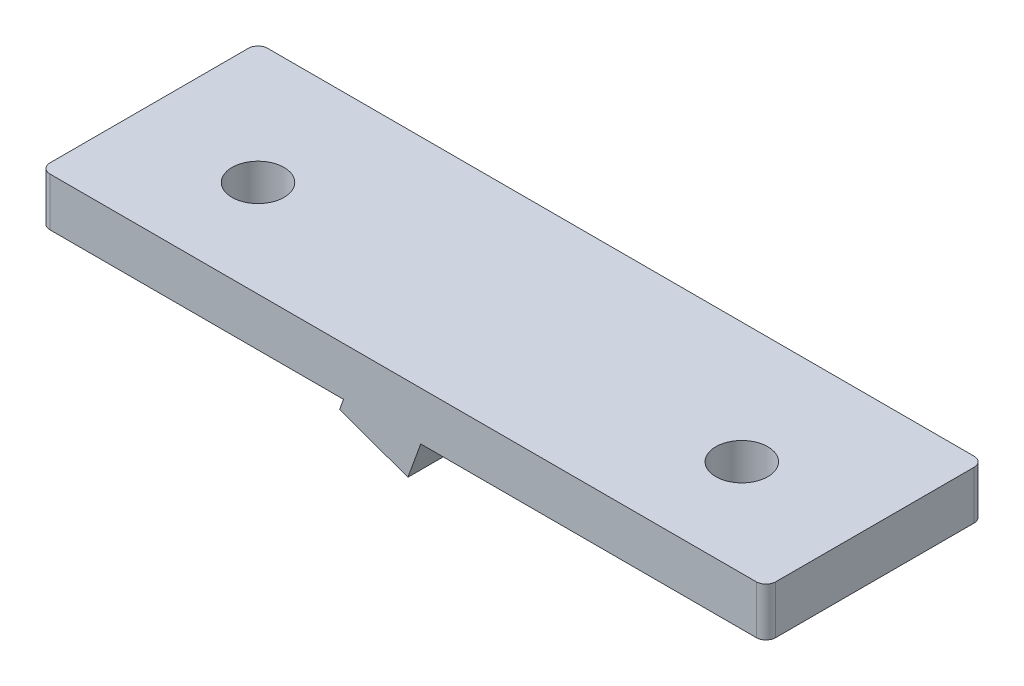
ISO-10303-21;
HEADER;
FILE_DESCRIPTION(('STEP AP214'),'2;1');
FILE_NAME('part.step','',(''),(''),'','','');
FILE_SCHEMA(('AUTOMOTIVE_DESIGN { 1 0 10303 214 1 1 1 1 }'));
ENDSEC;
DATA;
#1=APPLICATION_CONTEXT('core data for automotive mechanical design processes');
#2=APPLICATION_PROTOCOL_DEFINITION('international standard','automotive_design',2000,#1);
#3=PRODUCT_CONTEXT('',#1,'mechanical');
#4=PRODUCT('Part','Part','',(#3));
#5=PRODUCT_RELATED_PRODUCT_CATEGORY('part','',(#4));
#6=PRODUCT_DEFINITION_FORMATION('','',#4);
#7=PRODUCT_DEFINITION_CONTEXT('part definition',#1,'design');
#8=PRODUCT_DEFINITION('design','',#6,#7);
#9=PRODUCT_DEFINITION_SHAPE('','',#8);
#10=(LENGTH_UNIT() NAMED_UNIT(*) SI_UNIT(.MILLI.,.METRE.));
#11=(NAMED_UNIT(*) PLANE_ANGLE_UNIT() SI_UNIT($,.RADIAN.));
#12=(NAMED_UNIT(*) SI_UNIT($,.STERADIAN.) SOLID_ANGLE_UNIT());
#13=UNCERTAINTY_MEASURE_WITH_UNIT(LENGTH_MEASURE(1.E-05),#10,'distance_accuracy_value','');
#14=(GEOMETRIC_REPRESENTATION_CONTEXT(3) GLOBAL_UNCERTAINTY_ASSIGNED_CONTEXT((#13)) GLOBAL_UNIT_ASSIGNED_CONTEXT((#10,
#11,#12)) REPRESENTATION_CONTEXT('',''));
#15=CARTESIAN_POINT('',(0.,0.,0.));
#16=DIRECTION('',(0.,0.,1.));
#17=DIRECTION('',(1.,0.,0.));
#18=AXIS2_PLACEMENT_3D('',#15,#16,#17);
#19=CARTESIAN_POINT('',(0.,0.,0.));
#20=DIRECTION('',(0.,1.,0.));
#21=DIRECTION('',(0.,0.,1.));
#22=AXIS2_PLACEMENT_3D('',#19,#20,#21);
#23=PLANE('',#22);
#24=CARTESIAN_POINT('',(20.,0.,-8.));
#25=DIRECTION('',(0.,1.,0.));
#26=DIRECTION('',(0.,0.,1.));
#27=AXIS2_PLACEMENT_3D('',#24,#25,#26);
#28=CIRCLE('',#27,2.15);
#29=CARTESIAN_POINT('',(20.,0.,-5.85));
#30=VERTEX_POINT('',#29);
#31=EDGE_CURVE('E264',#30,#30,#28,.T.);
#32=ORIENTED_EDGE('',*,*,#31,.T.);
#33=EDGE_LOOP('',(#32));
#34=FACE_BOUND('',#33,.T.);
#35=DIRECTION('',(0.,0.,-1.));
#36=VECTOR('',#35,1.);
#37=CARTESIAN_POINT('',(30.,0.,-18.));
#38=LINE('',#37,#36);
#39=CARTESIAN_POINT('',(30.,0.,-0.799999999999999));
#40=VERTEX_POINT('',#39);
#41=CARTESIAN_POINT('',(30.,0.,-17.2));
#42=VERTEX_POINT('',#41);
#43=EDGE_CURVE('E291',#40,#42,#38,.T.);
#44=ORIENTED_EDGE('',*,*,#43,.F.);
#45=CARTESIAN_POINT('',(29.2,0.,-0.799999999999999));
#46=DIRECTION('',(0.,1.,0.));
#47=DIRECTION('',(0.,0.,1.));
#48=AXIS2_PLACEMENT_3D('',#45,#46,#47);
#49=CIRCLE('',#48,0.8);
#50=CARTESIAN_POINT('',(29.2,0.,0.));
#51=VERTEX_POINT('',#50);
#52=EDGE_CURVE('E11',#40,#51,#49,.F.);
#53=ORIENTED_EDGE('',*,*,#52,.T.);
#54=DIRECTION('',(1.,0.,0.));
#55=VECTOR('',#54,1.);
#56=CARTESIAN_POINT('',(-30.,0.,0.));
#57=LINE('',#56,#55);
#58=CARTESIAN_POINT('',(1.45415986702924,0.,0.));
#59=VERTEX_POINT('',#58);
#60=EDGE_CURVE('E289',#59,#51,#57,.T.);
#61=ORIENTED_EDGE('',*,*,#60,.F.);
#62=DIRECTION('',(0.,0.,-1.));
#63=VECTOR('',#62,1.);
#64=CARTESIAN_POINT('',(1.45415986702924,0.,0.));
#65=LINE('',#64,#63);
#66=CARTESIAN_POINT('',(1.45415986702924,0.,-4.00000000000002));
#67=VERTEX_POINT('',#66);
#68=EDGE_CURVE('E224',#59,#67,#65,.T.);
#69=ORIENTED_EDGE('',*,*,#68,.T.);
#70=CARTESIAN_POINT('',(-1.73837345039849,0.,-8.00000000000002));
#71=DIRECTION('',(0.,1.,0.));
#72=DIRECTION('',(1.,0.,0.));
#73=AXIS2_PLACEMENT_3D('',#70,#71,#72);
#74=ELLIPSE('',#73,5.32088886237956,5.);
#75=CARTESIAN_POINT('',(1.45415986702924,0.,-12.));
#76=VERTEX_POINT('',#75);
#77=EDGE_CURVE('E302',#67,#76,#74,.T.);
#78=ORIENTED_EDGE('',*,*,#77,.T.);
#79=DIRECTION('',(0.,0.,-1.));
#80=VECTOR('',#79,1.);
#81=CARTESIAN_POINT('',(1.45415986702924,0.,0.));
#82=LINE('',#81,#80);
#83=CARTESIAN_POINT('',(1.45415986702926,0.,-15.8));
#84=VERTEX_POINT('',#83);
#85=EDGE_CURVE('E211',#76,#84,#82,.T.);
#86=ORIENTED_EDGE('',*,*,#85,.T.);
#87=DIRECTION('',(1.,0.,0.));
#88=VECTOR('',#87,1.);
#89=CARTESIAN_POINT('',(19.3323464446246,0.,-15.8));
#90=LINE('',#89,#88);
#91=CARTESIAN_POINT('',(19.3323464446246,0.,-15.8));
#92=VERTEX_POINT('',#91);
#93=EDGE_CURVE('E251',#84,#92,#90,.T.);
#94=ORIENTED_EDGE('',*,*,#93,.T.);
#95=DIRECTION('',(0.,0.,-1.));
#96=VECTOR('',#95,1.);
#97=CARTESIAN_POINT('',(19.3323464446246,0.,-15.8));
#98=LINE('',#97,#96);
#99=CARTESIAN_POINT('',(19.3323464446246,0.,-18.));
#100=VERTEX_POINT('',#99);
#101=EDGE_CURVE('E255',#92,#100,#98,.T.);
#102=ORIENTED_EDGE('',*,*,#101,.T.);
#103=DIRECTION('',(-1.,0.,0.));
#104=VECTOR('',#103,1.);
#105=CARTESIAN_POINT('',(-30.,0.,-18.));
#106=LINE('',#105,#104);
#107=CARTESIAN_POINT('',(29.2,0.,-18.));
#108=VERTEX_POINT('',#107);
#109=EDGE_CURVE('E277',#108,#100,#106,.T.);
#110=ORIENTED_EDGE('',*,*,#109,.F.);
#111=CARTESIAN_POINT('',(29.2,0.,-17.2));
#112=DIRECTION('',(0.,1.,0.));
#113=DIRECTION('',(0.,0.,1.));
#114=AXIS2_PLACEMENT_3D('',#111,#112,#113);
#115=CIRCLE('',#114,0.8);
#116=EDGE_CURVE('E45',#108,#42,#115,.F.);
#117=ORIENTED_EDGE('',*,*,#116,.T.);
#118=EDGE_LOOP('',(#44,#53,#61,#69,#78,#86,#94,#102,#110,#117));
#119=FACE_BOUND('',#118,.T.);
#120=ADVANCED_FACE('F37',(#34,#119),#23,.F.);
#121=CARTESIAN_POINT('',(0.,0.,-15.8));
#122=DIRECTION('',(0.,0.,-1.));
#123=DIRECTION('',(-1.,0.,0.));
#124=AXIS2_PLACEMENT_3D('',#121,#122,#123);
#125=PLANE('',#124);
#126=DIRECTION('',(0.939692620785908,-0.342020143325671,0.));
#127=VECTOR('',#126,1.);
#128=CARTESIAN_POINT('',(-0.893674788207497,-2.45535130093597,-15.8));
#129=LINE('',#128,#127);
#130=CARTESIAN_POINT('',(-7.63969704435782,0.,-15.8));
#131=VERTEX_POINT('',#130);
#132=CARTESIAN_POINT('',(-5.24777503663613,-0.870588413496862,-15.8));
#133=VERTEX_POINT('',#132);
#134=EDGE_CURVE('E295',#131,#133,#129,.T.);
#135=ORIENTED_EDGE('',*,*,#134,.T.);
#136=DIRECTION('',(0.342020143325669,0.939692620785908,0.));
#137=VECTOR('',#136,1.);
#138=CARTESIAN_POINT('',(-4.35410024842863,1.5847628874391,-15.8));
#139=LINE('',#138,#137);
#140=CARTESIAN_POINT('',(-4.9309067678262,0.,-15.8));
#141=VERTEX_POINT('',#140);
#142=EDGE_CURVE('E218',#133,#141,#139,.T.);
#143=ORIENTED_EDGE('',*,*,#142,.T.);
#144=EDGE_CURVE('E252',#131,#141,#90,.T.);
#145=ORIENTED_EDGE('',*,*,#144,.F.);
#146=EDGE_LOOP('',(#135,#143,#145));
#147=FACE_BOUND('',#146,.T.);
#148=ADVANCED_FACE('F379',(#147),#125,.F.);
#149=CARTESIAN_POINT('',(-20.,0.,-8.));
#150=DIRECTION('',(0.,1.,0.));
#151=DIRECTION('',(0.,0.,1.));
#152=AXIS2_PLACEMENT_3D('',#149,#150,#151);
#153=CIRCLE('',#152,2.15);
#154=CARTESIAN_POINT('',(-20.,0.,-5.85));
#155=VERTEX_POINT('',#154);
#156=EDGE_CURVE('E260',#155,#155,#153,.T.);
#157=ORIENTED_EDGE('',*,*,#156,.T.);
#158=EDGE_LOOP('',(#157));
#159=FACE_BOUND('',#158,.T.);
#160=DIRECTION('',(0.,0.,1.));
#161=VECTOR('',#160,1.);
#162=CARTESIAN_POINT('',(-30.,0.,-18.));
#163=LINE('',#162,#161);
#164=CARTESIAN_POINT('',(-30.,0.,-17.2));
#165=VERTEX_POINT('',#164);
#166=CARTESIAN_POINT('',(-30.,0.,-0.799999999999999));
#167=VERTEX_POINT('',#166);
#168=EDGE_CURVE('E270',#165,#167,#163,.T.);
#169=ORIENTED_EDGE('',*,*,#168,.F.);
#170=CARTESIAN_POINT('',(-29.2,0.,-17.2));
#171=DIRECTION('',(0.,1.,0.));
#172=DIRECTION('',(0.,0.,1.));
#173=AXIS2_PLACEMENT_3D('',#170,#171,#172);
#174=CIRCLE('',#173,0.8);
#175=CARTESIAN_POINT('',(-29.2,0.,-18.));
#176=VERTEX_POINT('',#175);
#177=EDGE_CURVE('E311',#165,#176,#174,.F.);
#178=ORIENTED_EDGE('',*,*,#177,.T.);
#179=CARTESIAN_POINT('',(-10.2517956302058,0.,-18.));
#180=VERTEX_POINT('',#179);
#181=EDGE_CURVE('E293',#180,#176,#106,.T.);
#182=ORIENTED_EDGE('',*,*,#181,.F.);
#183=DIRECTION('',(0.,0.,1.));
#184=VECTOR('',#183,1.);
#185=CARTESIAN_POINT('',(-10.2517956302058,0.,0.));
#186=LINE('',#185,#184);
#187=CARTESIAN_POINT('',(-10.2517956302058,0.,-15.5));
#188=VERTEX_POINT('',#187);
#189=EDGE_CURVE('E244',#180,#188,#186,.T.);
#190=ORIENTED_EDGE('',*,*,#189,.T.);
#191=DIRECTION('',(1.,0.,0.));
#192=VECTOR('',#191,1.);
#193=CARTESIAN_POINT('',(0.,0.,-15.5));
#194=LINE('',#193,#192);
#195=CARTESIAN_POINT('',(-7.63969704435756,0.,-15.5));
#196=VERTEX_POINT('',#195);
#197=EDGE_CURVE('E297',#188,#196,#194,.T.);
#198=ORIENTED_EDGE('',*,*,#197,.T.);
#199=DIRECTION('',(0.,0.,-1.));
#200=VECTOR('',#199,1.);
#201=CARTESIAN_POINT('',(-7.63969704435756,0.,0.));
#202=LINE('',#201,#200);
#203=EDGE_CURVE('E241',#196,#131,#202,.T.);
#204=ORIENTED_EDGE('',*,*,#203,.T.);
#205=ORIENTED_EDGE('',*,*,#144,.T.);
#206=DIRECTION('',(0.,0.,1.));
#207=VECTOR('',#206,1.);
#208=CARTESIAN_POINT('',(-4.93090676782623,0.,0.));
#209=LINE('',#208,#207);
#210=CARTESIAN_POINT('',(-4.93090676782623,0.,-12.));
#211=VERTEX_POINT('',#210);
#212=EDGE_CURVE('E220',#141,#211,#209,.T.);
#213=ORIENTED_EDGE('',*,*,#212,.T.);
#214=CARTESIAN_POINT('',(-1.73837345039849,0.,-8.00000000000002));
#215=DIRECTION('',(0.,1.,0.));
#216=DIRECTION('',(1.,0.,0.));
#217=AXIS2_PLACEMENT_3D('',#214,#215,#216);
#218=ELLIPSE('',#217,5.32088886237956,5.);
#219=CARTESIAN_POINT('',(-4.93090676782623,0.,-4.00000000000002));
#220=VERTEX_POINT('',#219);
#221=EDGE_CURVE('E300',#211,#220,#218,.T.);
#222=ORIENTED_EDGE('',*,*,#221,.T.);
#223=DIRECTION('',(0.,0.,1.));
#224=VECTOR('',#223,1.);
#225=CARTESIAN_POINT('',(-4.93090676782623,0.,0.));
#226=LINE('',#225,#224);
#227=CARTESIAN_POINT('',(-4.93090676782623,0.,0.));
#228=VERTEX_POINT('',#227);
#229=EDGE_CURVE('E222',#220,#228,#226,.T.);
#230=ORIENTED_EDGE('',*,*,#229,.T.);
#231=CARTESIAN_POINT('',(-29.2,0.,0.));
#232=VERTEX_POINT('',#231);
#233=EDGE_CURVE('E197',#232,#228,#57,.T.);
#234=ORIENTED_EDGE('',*,*,#233,.F.);
#235=CARTESIAN_POINT('',(-29.2,0.,-0.8));
#236=DIRECTION('',(0.,1.,0.));
#237=DIRECTION('',(0.,0.,1.));
#238=AXIS2_PLACEMENT_3D('',#235,#236,#237);
#239=CIRCLE('',#238,0.8);
#240=EDGE_CURVE('E309',#232,#167,#239,.F.);
#241=ORIENTED_EDGE('',*,*,#240,.T.);
#242=EDGE_LOOP('',(#169,#178,#182,#190,#198,#204,#205,#213,#222,#230,#234,#241));
#243=FACE_BOUND('',#242,.T.);
#244=ADVANCED_FACE('F352',(#159,#243),#23,.F.);
#245=CARTESIAN_POINT('',(0.,4.,0.));
#246=DIRECTION('',(0.,1.,0.));
#247=DIRECTION('',(0.,0.,1.));
#248=AXIS2_PLACEMENT_3D('',#245,#246,#247);
#249=PLANE('',#248);
#250=CARTESIAN_POINT('',(20.,4.,-8.));
#251=DIRECTION('',(0.,1.,0.));
#252=DIRECTION('',(0.,0.,1.));
#253=AXIS2_PLACEMENT_3D('',#250,#251,#252);
#254=CIRCLE('',#253,2.15);
#255=CARTESIAN_POINT('',(20.,4.,-5.85));
#256=VERTEX_POINT('',#255);
#257=EDGE_CURVE('E267',#256,#256,#254,.T.);
#258=ORIENTED_EDGE('',*,*,#257,.F.);
#259=EDGE_LOOP('',(#258));
#260=FACE_BOUND('',#259,.T.);
#261=DIRECTION('',(-1.,0.,0.));
#262=VECTOR('',#261,1.);
#263=CARTESIAN_POINT('',(-30.,4.,-18.));
#264=LINE('',#263,#262);
#265=CARTESIAN_POINT('',(29.2,4.,-18.));
#266=VERTEX_POINT('',#265);
#267=CARTESIAN_POINT('',(-29.2,4.,-18.));
#268=VERTEX_POINT('',#267);
#269=EDGE_CURVE('E283',#266,#268,#264,.T.);
#270=ORIENTED_EDGE('',*,*,#269,.T.);
#271=CARTESIAN_POINT('',(-29.2,4.,-17.2));
#272=DIRECTION('',(0.,1.,0.));
#273=DIRECTION('',(0.,0.,1.));
#274=AXIS2_PLACEMENT_3D('',#271,#272,#273);
#275=CIRCLE('',#274,0.8);
#276=CARTESIAN_POINT('',(-30.,4.,-17.2));
#277=VERTEX_POINT('',#276);
#278=EDGE_CURVE('E324',#268,#277,#275,.T.);
#279=ORIENTED_EDGE('',*,*,#278,.T.);
#280=DIRECTION('',(0.,0.,1.));
#281=VECTOR('',#280,1.);
#282=CARTESIAN_POINT('',(-30.,4.,-18.));
#283=LINE('',#282,#281);
#284=CARTESIAN_POINT('',(-30.,4.,-0.799999999999999));
#285=VERTEX_POINT('',#284);
#286=EDGE_CURVE('E273',#277,#285,#283,.T.);
#287=ORIENTED_EDGE('',*,*,#286,.T.);
#288=CARTESIAN_POINT('',(-29.2,4.,-0.8));
#289=DIRECTION('',(0.,1.,0.));
#290=DIRECTION('',(0.,0.,1.));
#291=AXIS2_PLACEMENT_3D('',#288,#289,#290);
#292=CIRCLE('',#291,0.8);
#293=CARTESIAN_POINT('',(-29.2,4.,0.));
#294=VERTEX_POINT('',#293);
#295=EDGE_CURVE('E322',#285,#294,#292,.T.);
#296=ORIENTED_EDGE('',*,*,#295,.T.);
#297=DIRECTION('',(1.,0.,0.));
#298=VECTOR('',#297,1.);
#299=CARTESIAN_POINT('',(-30.,4.,0.));
#300=LINE('',#299,#298);
#301=CARTESIAN_POINT('',(29.2,4.,0.));
#302=VERTEX_POINT('',#301);
#303=EDGE_CURVE('E276',#294,#302,#300,.T.);
#304=ORIENTED_EDGE('',*,*,#303,.T.);
#305=CARTESIAN_POINT('',(29.2,4.,-0.799999999999999));
#306=DIRECTION('',(0.,1.,0.));
#307=DIRECTION('',(0.,0.,1.));
#308=AXIS2_PLACEMENT_3D('',#305,#306,#307);
#309=CIRCLE('',#308,0.8);
#310=CARTESIAN_POINT('',(30.,4.,-0.799999999999999));
#311=VERTEX_POINT('',#310);
#312=EDGE_CURVE('E320',#302,#311,#309,.T.);
#313=ORIENTED_EDGE('',*,*,#312,.T.);
#314=DIRECTION('',(0.,0.,-1.));
#315=VECTOR('',#314,1.);
#316=CARTESIAN_POINT('',(30.,4.,-18.));
#317=LINE('',#316,#315);
#318=CARTESIAN_POINT('',(30.,4.,-17.2));
#319=VERTEX_POINT('',#318);
#320=EDGE_CURVE('E280',#311,#319,#317,.T.);
#321=ORIENTED_EDGE('',*,*,#320,.T.);
#322=CARTESIAN_POINT('',(29.2,4.,-17.2));
#323=DIRECTION('',(0.,1.,0.));
#324=DIRECTION('',(0.,0.,1.));
#325=AXIS2_PLACEMENT_3D('',#322,#323,#324);
#326=CIRCLE('',#325,0.8);
#327=EDGE_CURVE('E318',#319,#266,#326,.T.);
#328=ORIENTED_EDGE('',*,*,#327,.T.);
#329=EDGE_LOOP('',(#270,#279,#287,#296,#304,#313,#321,#328));
#330=FACE_BOUND('',#329,.T.);
#331=CARTESIAN_POINT('',(-20.,4.,-8.));
#332=DIRECTION('',(0.,1.,0.));
#333=DIRECTION('',(0.,0.,1.));
#334=AXIS2_PLACEMENT_3D('',#331,#332,#333);
#335=CIRCLE('',#334,2.15);
#336=CARTESIAN_POINT('',(-20.,4.,-5.85));
#337=VERTEX_POINT('',#336);
#338=EDGE_CURVE('E261',#337,#337,#335,.T.);
#339=ORIENTED_EDGE('',*,*,#338,.F.);
#340=EDGE_LOOP('',(#339));
#341=FACE_BOUND('',#340,.T.);
#342=ADVANCED_FACE('F342',(#260,#330,#341),#249,.T.);
#343=CARTESIAN_POINT('',(-30.,4.,-18.));
#344=DIRECTION('',(1.,0.,0.));
#345=DIRECTION('',(0.,0.,-1.));
#346=AXIS2_PLACEMENT_3D('',#343,#344,#345);
#347=PLANE('',#346);
#348=ORIENTED_EDGE('',*,*,#286,.F.);
#349=DIRECTION('',(0.,-1.,0.));
#350=VECTOR('',#349,1.);
#351=CARTESIAN_POINT('',(-30.,4.,-17.2));
#352=LINE('',#351,#350);
#353=EDGE_CURVE('E306',#277,#165,#352,.T.);
#354=ORIENTED_EDGE('',*,*,#353,.T.);
#355=ORIENTED_EDGE('',*,*,#168,.T.);
#356=DIRECTION('',(0.,-1.,0.));
#357=VECTOR('',#356,1.);
#358=CARTESIAN_POINT('',(-30.,4.,-0.799999999999999));
#359=LINE('',#358,#357);
#360=EDGE_CURVE('E304',#167,#285,#359,.F.);
#361=ORIENTED_EDGE('',*,*,#360,.T.);
#362=EDGE_LOOP('',(#348,#354,#355,#361));
#363=FACE_BOUND('',#362,.T.);
#364=ADVANCED_FACE('F355',(#363),#347,.F.);
#365=CARTESIAN_POINT('',(-30.,4.,0.));
#366=DIRECTION('',(0.,0.,-1.));
#367=DIRECTION('',(-1.,0.,0.));
#368=AXIS2_PLACEMENT_3D('',#365,#366,#367);
#369=PLANE('',#368);
#370=ORIENTED_EDGE('',*,*,#303,.F.);
#371=DIRECTION('',(0.,-1.,0.));
#372=VECTOR('',#371,1.);
#373=CARTESIAN_POINT('',(-29.2,4.,0.));
#374=LINE('',#373,#372);
#375=EDGE_CURVE('E328',#294,#232,#374,.T.);
#376=ORIENTED_EDGE('',*,*,#375,.T.);
#377=ORIENTED_EDGE('',*,*,#233,.T.);
#378=DIRECTION('',(0.342020143325669,0.939692620785908,0.));
#379=VECTOR('',#378,1.);
#380=CARTESIAN_POINT('',(-12.290400829533,-20.2200437531498,0.));
#381=LINE('',#380,#379);
#382=CARTESIAN_POINT('',(-5.24777503663613,-0.870588413496864,0.));
#383=VERTEX_POINT('',#382);
#384=EDGE_CURVE('E192',#383,#228,#381,.T.);
#385=ORIENTED_EDGE('',*,*,#384,.F.);
#386=DIRECTION('',(-0.939692620785908,0.342020143325671,0.));
#387=VECTOR('',#386,1.);
#388=CARTESIAN_POINT('',(-5.2477750366361,-0.870588413496871,0.));
#389=LINE('',#388,#387);
#390=CARTESIAN_POINT('',(0.390380688079318,-2.92270927345089,0.));
#391=VERTEX_POINT('',#390);
#392=EDGE_CURVE('E178',#391,#383,#389,.T.);
#393=ORIENTED_EDGE('',*,*,#392,.F.);
#394=DIRECTION('',(0.342020143325669,0.939692620785908,0.));
#395=VECTOR('',#394,1.);
#396=CARTESIAN_POINT('',(-6.65224510481759,-22.2721646131038,0.));
#397=LINE('',#396,#395);
#398=EDGE_CURVE('E201',#391,#59,#397,.T.);
#399=ORIENTED_EDGE('',*,*,#398,.T.);
#400=ORIENTED_EDGE('',*,*,#60,.T.);
#401=DIRECTION('',(0.,-1.,0.));
#402=VECTOR('',#401,1.);
#403=CARTESIAN_POINT('',(29.2,4.,0.));
#404=LINE('',#403,#402);
#405=EDGE_CURVE('E326',#51,#302,#404,.F.);
#406=ORIENTED_EDGE('',*,*,#405,.T.);
#407=EDGE_LOOP('',(#370,#376,#377,#385,#393,#399,#400,#406));
#408=FACE_BOUND('',#407,.T.);
#409=ADVANCED_FACE('F194',(#408),#369,.F.);
#410=CARTESIAN_POINT('',(30.,4.,-18.));
#411=DIRECTION('',(-1.,0.,0.));
#412=DIRECTION('',(0.,0.,1.));
#413=AXIS2_PLACEMENT_3D('',#410,#411,#412);
#414=PLANE('',#413);
#415=ORIENTED_EDGE('',*,*,#320,.F.);
#416=DIRECTION('',(0.,-1.,0.));
#417=VECTOR('',#416,1.);
#418=CARTESIAN_POINT('',(30.,4.,-0.799999999999999));
#419=LINE('',#418,#417);
#420=EDGE_CURVE('E332',#311,#40,#419,.T.);
#421=ORIENTED_EDGE('',*,*,#420,.T.);
#422=ORIENTED_EDGE('',*,*,#43,.T.);
#423=DIRECTION('',(0.,-1.,0.));
#424=VECTOR('',#423,1.);
#425=CARTESIAN_POINT('',(30.,4.,-17.2));
#426=LINE('',#425,#424);
#427=EDGE_CURVE('E330',#42,#319,#426,.F.);
#428=ORIENTED_EDGE('',*,*,#427,.T.);
#429=EDGE_LOOP('',(#415,#421,#422,#428));
#430=FACE_BOUND('',#429,.T.);
#431=ADVANCED_FACE('F335',(#430),#414,.F.);
#432=CARTESIAN_POINT('',(-30.,4.,-18.));
#433=DIRECTION('',(0.,0.,1.));
#434=DIRECTION('',(1.,0.,0.));
#435=AXIS2_PLACEMENT_3D('',#432,#433,#434);
#436=PLANE('',#435);
#437=ORIENTED_EDGE('',*,*,#181,.T.);
#438=DIRECTION('',(0.,-1.,0.));
#439=VECTOR('',#438,1.);
#440=CARTESIAN_POINT('',(-29.2,4.,-18.));
#441=LINE('',#440,#439);
#442=EDGE_CURVE('E316',#176,#268,#441,.F.);
#443=ORIENTED_EDGE('',*,*,#442,.T.);
#444=ORIENTED_EDGE('',*,*,#269,.F.);
#445=DIRECTION('',(0.,-1.,0.));
#446=VECTOR('',#445,1.);
#447=CARTESIAN_POINT('',(29.2,4.,-18.));
#448=LINE('',#447,#446);
#449=EDGE_CURVE('E313',#266,#108,#448,.T.);
#450=ORIENTED_EDGE('',*,*,#449,.T.);
#451=ORIENTED_EDGE('',*,*,#109,.T.);
#452=DIRECTION('',(-0.342020143325669,-0.939692620785908,0.));
#453=VECTOR('',#452,1.);
#454=CARTESIAN_POINT('',(19.3323464446246,0.,-18.));
#455=LINE('',#454,#453);
#456=CARTESIAN_POINT('',(16.1772167172826,-8.66864768132215,-18.));
#457=VERTEX_POINT('',#456);
#458=EDGE_CURVE('E247',#100,#457,#455,.T.);
#459=ORIENTED_EDGE('',*,*,#458,.T.);
#460=DIRECTION('',(0.939692620785908,-0.342020143325671,0.));
#461=VECTOR('',#460,1.);
#462=CARTESIAN_POINT('',(16.3651552414398,-8.73705170998729,-18.));
#463=LINE('',#462,#461);
#464=CARTESIAN_POINT('',(-9.94623814056565,0.839512303131486,-18.));
#465=VERTEX_POINT('',#464);
#466=EDGE_CURVE('E226',#465,#457,#463,.T.);
#467=ORIENTED_EDGE('',*,*,#466,.F.);
#468=DIRECTION('',(0.34202014332567,0.939692620785908,0.));
#469=VECTOR('',#468,1.);
#470=CARTESIAN_POINT('',(-9.94623814056565,0.839512303131486,-18.));
#471=LINE('',#470,#469);
#472=EDGE_CURVE('E231',#180,#465,#471,.T.);
#473=ORIENTED_EDGE('',*,*,#472,.F.);
#474=EDGE_LOOP('',(#437,#443,#444,#450,#451,#459,#467,#473));
#475=FACE_BOUND('',#474,.T.);
#476=ADVANCED_FACE('F365',(#475),#436,.F.);
#477=CARTESIAN_POINT('',(20.,4.,-8.));
#478=DIRECTION('',(0.,-1.,0.));
#479=DIRECTION('',(0.,0.,-1.));
#480=AXIS2_PLACEMENT_3D('',#477,#478,#479);
#481=CYLINDRICAL_SURFACE('',#480,2.15);
#482=ORIENTED_EDGE('',*,*,#257,.T.);
#483=EDGE_LOOP('',(#482));
#484=FACE_BOUND('',#483,.T.);
#485=ORIENTED_EDGE('',*,*,#31,.F.);
#486=EDGE_LOOP('',(#485));
#487=FACE_BOUND('',#486,.T.);
#488=ADVANCED_FACE('F446',(#484,#487),#481,.F.);
#489=CARTESIAN_POINT('',(-20.,4.,-8.));
#490=DIRECTION('',(0.,-1.,0.));
#491=DIRECTION('',(0.,0.,-1.));
#492=AXIS2_PLACEMENT_3D('',#489,#490,#491);
#493=CYLINDRICAL_SURFACE('',#492,2.15);
#494=ORIENTED_EDGE('',*,*,#338,.T.);
#495=EDGE_LOOP('',(#494));
#496=FACE_BOUND('',#495,.T.);
#497=ORIENTED_EDGE('',*,*,#156,.F.);
#498=EDGE_LOOP('',(#497));
#499=FACE_BOUND('',#498,.T.);
#500=ADVANCED_FACE('F444',(#496,#499),#493,.F.);
#501=CARTESIAN_POINT('',(19.3323464446246,0.,-15.8));
#502=DIRECTION('',(0.939692620785908,-0.342020143325669,0.));
#503=DIRECTION('',(0.342020143325669,0.939692620785908,0.));
#504=AXIS2_PLACEMENT_3D('',#501,#502,#503);
#505=PLANE('',#504);
#506=DIRECTION('',(0.,0.,1.));
#507=VECTOR('',#506,1.);
#508=CARTESIAN_POINT('',(16.1772167172826,-8.66864768132215,-15.8));
#509=LINE('',#508,#507);
#510=CARTESIAN_POINT('',(16.1772167172826,-8.66864768132215,-15.8));
#511=VERTEX_POINT('',#510);
#512=EDGE_CURVE('E238',#457,#511,#509,.T.);
#513=ORIENTED_EDGE('',*,*,#512,.F.);
#514=ORIENTED_EDGE('',*,*,#458,.F.);
#515=ORIENTED_EDGE('',*,*,#101,.F.);
#516=DIRECTION('',(-0.342020143325669,-0.939692620785908,0.));
#517=VECTOR('',#516,1.);
#518=CARTESIAN_POINT('',(19.3323464446246,0.,-15.8));
#519=LINE('',#518,#517);
#520=EDGE_CURVE('E248',#92,#511,#519,.T.);
#521=ORIENTED_EDGE('',*,*,#520,.T.);
#522=EDGE_LOOP('',(#513,#514,#515,#521));
#523=FACE_BOUND('',#522,.T.);
#524=ADVANCED_FACE('F420',(#523),#505,.T.);
#525=ORIENTED_EDGE('',*,*,#93,.F.);
#526=DIRECTION('',(-0.342020143325669,-0.939692620785908,0.));
#527=VECTOR('',#526,1.);
#528=CARTESIAN_POINT('',(1.28405547628681,-0.467357972514913,-15.8));
#529=LINE('',#528,#527);
#530=CARTESIAN_POINT('',(0.390380688079321,-2.92270927345089,-15.8));
#531=VERTEX_POINT('',#530);
#532=EDGE_CURVE('E207',#84,#531,#529,.T.);
#533=ORIENTED_EDGE('',*,*,#532,.T.);
#534=EDGE_CURVE('E286',#531,#511,#129,.T.);
#535=ORIENTED_EDGE('',*,*,#534,.T.);
#536=ORIENTED_EDGE('',*,*,#520,.F.);
#537=EDGE_LOOP('',(#525,#533,#535,#536));
#538=FACE_BOUND('',#537,.T.);
#539=ADVANCED_FACE('F415',(#538),#125,.F.);
#540=CARTESIAN_POINT('',(0.,0.,-15.5));
#541=DIRECTION('',(0.,0.,1.));
#542=DIRECTION('',(1.,0.,0.));
#543=AXIS2_PLACEMENT_3D('',#540,#541,#542);
#544=PLANE('',#543);
#545=DIRECTION('',(0.34202014332567,0.939692620785908,0.));
#546=VECTOR('',#545,1.);
#547=CARTESIAN_POINT('',(-9.94623814056565,0.839512303131486,-15.5));
#548=LINE('',#547,#546);
#549=CARTESIAN_POINT('',(-9.94623814056565,0.839512303131486,-15.5));
#550=VERTEX_POINT('',#549);
#551=EDGE_CURVE('E230',#188,#550,#548,.T.);
#552=ORIENTED_EDGE('',*,*,#551,.T.);
#553=DIRECTION('',(0.939692620785908,-0.342020143325671,0.));
#554=VECTOR('',#553,1.);
#555=CARTESIAN_POINT('',(16.3651552414398,-8.73705170998729,-15.5));
#556=LINE('',#555,#554);
#557=EDGE_CURVE('E227',#550,#196,#556,.T.);
#558=ORIENTED_EDGE('',*,*,#557,.T.);
#559=ORIENTED_EDGE('',*,*,#197,.F.);
#560=EDGE_LOOP('',(#552,#558,#559));
#561=FACE_BOUND('',#560,.T.);
#562=ADVANCED_FACE('F375',(#561),#544,.F.);
#563=CARTESIAN_POINT('',(-9.94623814056565,0.839512303131486,-15.5));
#564=DIRECTION('',(-0.939692620785908,0.34202014332567,0.));
#565=DIRECTION('',(-0.34202014332567,-0.939692620785908,0.));
#566=AXIS2_PLACEMENT_3D('',#563,#564,#565);
#567=PLANE('',#566);
#568=ORIENTED_EDGE('',*,*,#472,.T.);
#569=DIRECTION('',(0.,0.,-1.));
#570=VECTOR('',#569,1.);
#571=CARTESIAN_POINT('',(-9.94623814056565,0.839512303131486,-15.5));
#572=LINE('',#571,#570);
#573=EDGE_CURVE('E233',#550,#465,#572,.T.);
#574=ORIENTED_EDGE('',*,*,#573,.F.);
#575=ORIENTED_EDGE('',*,*,#551,.F.);
#576=ORIENTED_EDGE('',*,*,#189,.F.);
#577=EDGE_LOOP('',(#568,#574,#575,#576));
#578=FACE_BOUND('',#577,.T.);
#579=ADVANCED_FACE('F370',(#578),#567,.F.);
#580=CARTESIAN_POINT('',(16.3651552414398,-8.73705170998729,-15.5));
#581=DIRECTION('',(0.342020143325671,0.939692620785908,0.));
#582=DIRECTION('',(-0.939692620785908,0.342020143325671,0.));
#583=AXIS2_PLACEMENT_3D('',#580,#581,#582);
#584=PLANE('',#583);
#585=ORIENTED_EDGE('',*,*,#534,.F.);
#586=DIRECTION('',(0.,0.,1.));
#587=VECTOR('',#586,1.);
#588=CARTESIAN_POINT('',(0.39038068807932,-2.92270927345089,-12.));
#589=LINE('',#588,#587);
#590=CARTESIAN_POINT('',(0.390380688079322,-2.92270927345088,-12.));
#591=VERTEX_POINT('',#590);
#592=EDGE_CURVE('E387',#531,#591,#589,.T.);
#593=ORIENTED_EDGE('',*,*,#592,.T.);
#594=CARTESIAN_POINT('',(-2.4286971742784,-1.89664884347387,-8.00000000000002));
#595=DIRECTION('',(0.342020143325671,0.939692620785908,0.));
#596=DIRECTION('',(-0.939692620785908,0.342020143325671,0.));
#597=AXIS2_PLACEMENT_3D('',#594,#595,#596);
#598=CIRCLE('',#597,5.);
#599=CARTESIAN_POINT('',(0.390380688079319,-2.92270927345089,-4.00000000000002));
#600=VERTEX_POINT('',#599);
#601=EDGE_CURVE('E389',#591,#600,#598,.F.);
#602=ORIENTED_EDGE('',*,*,#601,.T.);
#603=DIRECTION('',(0.,0.,1.));
#604=VECTOR('',#603,1.);
#605=CARTESIAN_POINT('',(0.390380688079318,-2.92270927345089,0.));
#606=LINE('',#605,#604);
#607=EDGE_CURVE('E185',#600,#391,#606,.T.);
#608=ORIENTED_EDGE('',*,*,#607,.T.);
#609=ORIENTED_EDGE('',*,*,#392,.T.);
#610=DIRECTION('',(0.,0.,-1.));
#611=VECTOR('',#610,1.);
#612=CARTESIAN_POINT('',(-5.24777503663613,-0.870588413496864,0.));
#613=LINE('',#612,#611);
#614=CARTESIAN_POINT('',(-5.24777503663613,-0.870588413496864,-4.00000000000002));
#615=VERTEX_POINT('',#614);
#616=EDGE_CURVE('E182',#383,#615,#613,.T.);
#617=ORIENTED_EDGE('',*,*,#616,.T.);
#618=CARTESIAN_POINT('',(-2.4286971742784,-1.89664884347387,-8.00000000000002));
#619=DIRECTION('',(0.342020143325671,0.939692620785908,0.));
#620=DIRECTION('',(-0.939692620785908,0.342020143325671,0.));
#621=AXIS2_PLACEMENT_3D('',#618,#619,#620);
#622=CIRCLE('',#621,5.);
#623=CARTESIAN_POINT('',(-5.24777503663613,-0.870588413496864,-12.));
#624=VERTEX_POINT('',#623);
#625=EDGE_CURVE('E208',#615,#624,#622,.F.);
#626=ORIENTED_EDGE('',*,*,#625,.T.);
#627=DIRECTION('',(0.,0.,-1.));
#628=VECTOR('',#627,1.);
#629=CARTESIAN_POINT('',(-5.24777503663613,-0.870588413496864,-12.));
#630=LINE('',#629,#628);
#631=EDGE_CURVE('E213',#624,#133,#630,.T.);
#632=ORIENTED_EDGE('',*,*,#631,.T.);
#633=ORIENTED_EDGE('',*,*,#134,.F.);
#634=ORIENTED_EDGE('',*,*,#203,.F.);
#635=ORIENTED_EDGE('',*,*,#557,.F.);
#636=ORIENTED_EDGE('',*,*,#573,.T.);
#637=ORIENTED_EDGE('',*,*,#466,.T.);
#638=ORIENTED_EDGE('',*,*,#512,.T.);
#639=EDGE_LOOP('',(#585,#593,#602,#608,#609,#617,#626,#632,#633,#634,#635,#636,#637,#638));
#640=FACE_BOUND('',#639,.T.);
#641=ADVANCED_FACE('F180',(#640),#584,.F.);
#642=CARTESIAN_POINT('',(-9.47132296717532,-21.2461041831268,-8.00000000000002));
#643=DIRECTION('',(0.342020143325669,0.939692620785908,0.));
#644=DIRECTION('',(-0.939692620785908,0.342020143325669,0.));
#645=AXIS2_PLACEMENT_3D('',#642,#643,#644);
#646=CYLINDRICAL_SURFACE('',#645,5.);
#647=ORIENTED_EDGE('',*,*,#221,.F.);
#648=DIRECTION('',(0.342020143325669,0.939692620785908,0.));
#649=VECTOR('',#648,1.);
#650=CARTESIAN_POINT('',(-12.290400829533,-20.2200437531498,-12.));
#651=LINE('',#650,#649);
#652=EDGE_CURVE('E189',#624,#211,#651,.T.);
#653=ORIENTED_EDGE('',*,*,#652,.F.);
#654=ORIENTED_EDGE('',*,*,#625,.F.);
#655=DIRECTION('',(0.342020143325669,0.939692620785908,0.));
#656=VECTOR('',#655,1.);
#657=CARTESIAN_POINT('',(-12.290400829533,-20.2200437531498,-4.00000000000002));
#658=LINE('',#657,#656);
#659=EDGE_CURVE('E202',#615,#220,#658,.T.);
#660=ORIENTED_EDGE('',*,*,#659,.T.);
#661=EDGE_LOOP('',(#647,#653,#654,#660));
#662=FACE_BOUND('',#661,.T.);
#663=ADVANCED_FACE('F460',(#662),#646,.T.);
#664=CARTESIAN_POINT('',(-9.47132296717532,-21.2461041831268,-8.00000000000002));
#665=DIRECTION('',(0.342020143325669,0.939692620785908,0.));
#666=DIRECTION('',(-0.939692620785908,0.342020143325669,0.));
#667=AXIS2_PLACEMENT_3D('',#664,#665,#666);
#668=CYLINDRICAL_SURFACE('',#667,5.);
#669=ORIENTED_EDGE('',*,*,#77,.F.);
#670=DIRECTION('',(0.342020143325669,0.939692620785908,0.));
#671=VECTOR('',#670,1.);
#672=CARTESIAN_POINT('',(-6.65224510481759,-22.2721646131038,-4.00000000000002));
#673=LINE('',#672,#671);
#674=EDGE_CURVE('E397',#600,#67,#673,.T.);
#675=ORIENTED_EDGE('',*,*,#674,.F.);
#676=ORIENTED_EDGE('',*,*,#601,.F.);
#677=DIRECTION('',(0.342020143325669,0.939692620785908,0.));
#678=VECTOR('',#677,1.);
#679=CARTESIAN_POINT('',(-6.65224510481759,-22.2721646131038,-12.));
#680=LINE('',#679,#678);
#681=EDGE_CURVE('E394',#591,#76,#680,.T.);
#682=ORIENTED_EDGE('',*,*,#681,.T.);
#683=EDGE_LOOP('',(#669,#675,#676,#682));
#684=FACE_BOUND('',#683,.T.);
#685=ADVANCED_FACE('F406',(#684),#668,.T.);
#686=CARTESIAN_POINT('',(-6.65224510481759,-22.2721646131038,0.));
#687=DIRECTION('',(0.939692620785908,-0.342020143325669,0.));
#688=DIRECTION('',(0.342020143325669,0.939692620785908,0.));
#689=AXIS2_PLACEMENT_3D('',#686,#687,#688);
#690=PLANE('',#689);
#691=ORIENTED_EDGE('',*,*,#68,.F.);
#692=ORIENTED_EDGE('',*,*,#398,.F.);
#693=ORIENTED_EDGE('',*,*,#607,.F.);
#694=ORIENTED_EDGE('',*,*,#674,.T.);
#695=EDGE_LOOP('',(#691,#692,#693,#694));
#696=FACE_BOUND('',#695,.T.);
#697=ADVANCED_FACE('F402',(#696),#690,.T.);
#698=CARTESIAN_POINT('',(-12.290400829533,-20.2200437531498,0.));
#699=DIRECTION('',(-0.939692620785908,0.342020143325669,0.));
#700=DIRECTION('',(-0.342020143325669,-0.939692620785908,0.));
#701=AXIS2_PLACEMENT_3D('',#698,#699,#700);
#702=PLANE('',#701);
#703=ORIENTED_EDGE('',*,*,#229,.F.);
#704=ORIENTED_EDGE('',*,*,#659,.F.);
#705=ORIENTED_EDGE('',*,*,#616,.F.);
#706=ORIENTED_EDGE('',*,*,#384,.T.);
#707=EDGE_LOOP('',(#703,#704,#705,#706));
#708=FACE_BOUND('',#707,.T.);
#709=ADVANCED_FACE('F205',(#708),#702,.T.);
#710=CARTESIAN_POINT('',(-12.290400829533,-20.2200437531498,-12.));
#711=DIRECTION('',(-0.939692620785908,0.342020143325669,0.));
#712=DIRECTION('',(-0.342020143325669,-0.939692620785908,0.));
#713=AXIS2_PLACEMENT_3D('',#710,#711,#712);
#714=PLANE('',#713);
#715=ORIENTED_EDGE('',*,*,#212,.F.);
#716=ORIENTED_EDGE('',*,*,#142,.F.);
#717=ORIENTED_EDGE('',*,*,#631,.F.);
#718=ORIENTED_EDGE('',*,*,#652,.T.);
#719=EDGE_LOOP('',(#715,#716,#717,#718));
#720=FACE_BOUND('',#719,.T.);
#721=ADVANCED_FACE('F384',(#720),#714,.T.);
#722=CARTESIAN_POINT('',(-6.65224510481759,-22.2721646131038,-12.));
#723=DIRECTION('',(0.939692620785908,-0.342020143325669,0.));
#724=DIRECTION('',(0.342020143325669,0.939692620785908,0.));
#725=AXIS2_PLACEMENT_3D('',#722,#723,#724);
#726=PLANE('',#725);
#727=ORIENTED_EDGE('',*,*,#85,.F.);
#728=ORIENTED_EDGE('',*,*,#681,.F.);
#729=ORIENTED_EDGE('',*,*,#592,.F.);
#730=ORIENTED_EDGE('',*,*,#532,.F.);
#731=EDGE_LOOP('',(#727,#728,#729,#730));
#732=FACE_BOUND('',#731,.T.);
#733=ADVANCED_FACE('F412',(#732),#726,.T.);
#734=CARTESIAN_POINT('',(-29.2,4.,-17.2));
#735=DIRECTION('',(0.,-1.,0.));
#736=DIRECTION('',(0.,0.,-1.));
#737=AXIS2_PLACEMENT_3D('',#734,#735,#736);
#738=CYLINDRICAL_SURFACE('',#737,0.8);
#739=ORIENTED_EDGE('',*,*,#278,.F.);
#740=ORIENTED_EDGE('',*,*,#442,.F.);
#741=ORIENTED_EDGE('',*,*,#177,.F.);
#742=ORIENTED_EDGE('',*,*,#353,.F.);
#743=EDGE_LOOP('',(#739,#740,#741,#742));
#744=FACE_BOUND('',#743,.T.);
#745=ADVANCED_FACE('F359',(#744),#738,.T.);
#746=CARTESIAN_POINT('',(-29.2,4.,-0.8));
#747=DIRECTION('',(0.,-1.,0.));
#748=DIRECTION('',(0.,0.,-1.));
#749=AXIS2_PLACEMENT_3D('',#746,#747,#748);
#750=CYLINDRICAL_SURFACE('',#749,0.8);
#751=ORIENTED_EDGE('',*,*,#295,.F.);
#752=ORIENTED_EDGE('',*,*,#360,.F.);
#753=ORIENTED_EDGE('',*,*,#240,.F.);
#754=ORIENTED_EDGE('',*,*,#375,.F.);
#755=EDGE_LOOP('',(#751,#752,#753,#754));
#756=FACE_BOUND('',#755,.T.);
#757=ADVANCED_FACE('F348',(#756),#750,.T.);
#758=CARTESIAN_POINT('',(29.2,4.,-0.799999999999999));
#759=DIRECTION('',(0.,-1.,0.));
#760=DIRECTION('',(0.,0.,-1.));
#761=AXIS2_PLACEMENT_3D('',#758,#759,#760);
#762=CYLINDRICAL_SURFACE('',#761,0.8);
#763=ORIENTED_EDGE('',*,*,#312,.F.);
#764=ORIENTED_EDGE('',*,*,#405,.F.);
#765=ORIENTED_EDGE('',*,*,#52,.F.);
#766=ORIENTED_EDGE('',*,*,#420,.F.);
#767=EDGE_LOOP('',(#763,#764,#765,#766));
#768=FACE_BOUND('',#767,.T.);
#769=ADVANCED_FACE('F340',(#768),#762,.T.);
#770=CARTESIAN_POINT('',(29.2,4.,-17.2));
#771=DIRECTION('',(0.,-1.,0.));
#772=DIRECTION('',(0.,0.,-1.));
#773=AXIS2_PLACEMENT_3D('',#770,#771,#772);
#774=CYLINDRICAL_SURFACE('',#773,0.8);
#775=ORIENTED_EDGE('',*,*,#327,.F.);
#776=ORIENTED_EDGE('',*,*,#427,.F.);
#777=ORIENTED_EDGE('',*,*,#116,.F.);
#778=ORIENTED_EDGE('',*,*,#449,.F.);
#779=EDGE_LOOP('',(#775,#776,#777,#778));
#780=FACE_BOUND('',#779,.T.);
#781=ADVANCED_FACE('F39',(#780),#774,.T.);
#782=CLOSED_SHELL('',(#120,#148,#244,#342,#364,#409,#431,#476,#488,#500,#524,#539,#562,#579,
#641,#663,#685,#697,#709,#721,#733,#745,#757,#769,#781));
#783=MANIFOLD_SOLID_BREP('B2',#782);
#784=ADVANCED_BREP_SHAPE_REPRESENTATION('',(#18,#783),#14);
#785=SHAPE_DEFINITION_REPRESENTATION(#9,#784);
ENDSEC;
END-ISO-10303-21;
